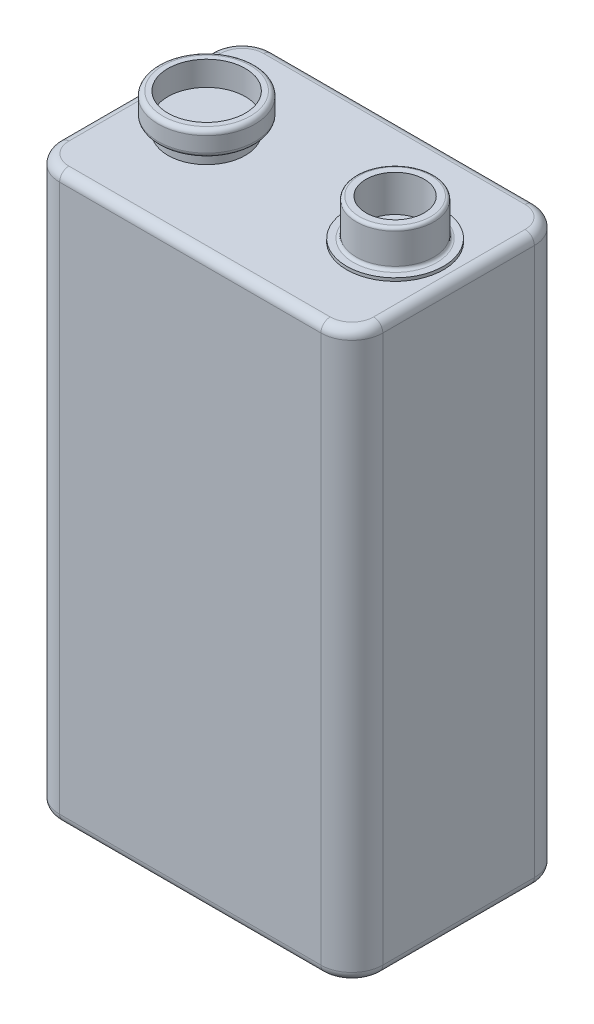
ISO-10303-21;
HEADER;
FILE_DESCRIPTION(('STEP AP214'),'2;1');
FILE_NAME('part.step','',(''),(''),'','','');
FILE_SCHEMA(('AUTOMOTIVE_DESIGN { 1 0 10303 214 1 1 1 1 }'));
ENDSEC;
DATA;
#1=APPLICATION_CONTEXT('core data for automotive mechanical design processes');
#2=APPLICATION_PROTOCOL_DEFINITION('international standard','automotive_design',2000,#1);
#3=PRODUCT_CONTEXT('',#1,'mechanical');
#4=PRODUCT('Part','Part','',(#3));
#5=PRODUCT_RELATED_PRODUCT_CATEGORY('part','',(#4));
#6=PRODUCT_DEFINITION_FORMATION('','',#4);
#7=PRODUCT_DEFINITION_CONTEXT('part definition',#1,'design');
#8=PRODUCT_DEFINITION('design','',#6,#7);
#9=PRODUCT_DEFINITION_SHAPE('','',#8);
#10=(LENGTH_UNIT() NAMED_UNIT(*) SI_UNIT(.MILLI.,.METRE.));
#11=(NAMED_UNIT(*) PLANE_ANGLE_UNIT() SI_UNIT($,.RADIAN.));
#12=(NAMED_UNIT(*) SI_UNIT($,.STERADIAN.) SOLID_ANGLE_UNIT());
#13=UNCERTAINTY_MEASURE_WITH_UNIT(LENGTH_MEASURE(1.E-05),#10,'distance_accuracy_value','');
#14=(GEOMETRIC_REPRESENTATION_CONTEXT(3) GLOBAL_UNCERTAINTY_ASSIGNED_CONTEXT((#13)) GLOBAL_UNIT_ASSIGNED_CONTEXT((#10,
#11,#12)) REPRESENTATION_CONTEXT('',''));
#15=CARTESIAN_POINT('',(0.,0.,0.));
#16=DIRECTION('',(0.,0.,1.));
#17=DIRECTION('',(1.,0.,0.));
#18=AXIS2_PLACEMENT_3D('',#15,#16,#17);
#19=CARTESIAN_POINT('',(5.842,49.4,-8.75));
#20=DIRECTION('',(0.,1.,0.));
#21=DIRECTION('',(0.,0.,1.));
#22=AXIS2_PLACEMENT_3D('',#19,#20,#21);
#23=PLANE('',#22);
#24=CARTESIAN_POINT('',(5.842,49.4,-8.75));
#25=DIRECTION('',(0.,1.,0.));
#26=DIRECTION('',(0.,0.,1.));
#27=AXIS2_PLACEMENT_3D('',#24,#25,#26);
#28=CIRCLE('',#27,3.58775);
#29=CARTESIAN_POINT('',(5.842,49.4,-5.16225));
#30=VERTEX_POINT('',#29);
#31=EDGE_CURVE('E65',#30,#30,#28,.T.);
#32=ORIENTED_EDGE('',*,*,#31,.T.);
#33=EDGE_LOOP('',(#32));
#34=FACE_BOUND('',#33,.T.);
#35=CARTESIAN_POINT('',(5.842,49.4,-8.75));
#36=DIRECTION('',(0.,1.,0.));
#37=DIRECTION('',(0.,0.,1.));
#38=AXIS2_PLACEMENT_3D('',#35,#36,#37);
#39=CIRCLE('',#38,3.175);
#40=CARTESIAN_POINT('',(5.842,49.4,-5.575));
#41=VERTEX_POINT('',#40);
#42=EDGE_CURVE('E70',#41,#41,#39,.T.);
#43=ORIENTED_EDGE('',*,*,#42,.F.);
#44=EDGE_LOOP('',(#43));
#45=FACE_BOUND('',#44,.T.);
#46=ADVANCED_FACE('F50',(#34,#45),#23,.T.);
#47=CARTESIAN_POINT('',(5.842,47.4,-8.75));
#48=DIRECTION('',(0.,1.,0.));
#49=DIRECTION('',(0.,0.,1.));
#50=AXIS2_PLACEMENT_3D('',#47,#48,#49);
#51=PLANE('',#50);
#52=CARTESIAN_POINT('',(5.842,47.4,-8.75));
#53=DIRECTION('',(0.,1.,0.));
#54=DIRECTION('',(0.,0.,1.));
#55=AXIS2_PLACEMENT_3D('',#52,#53,#54);
#56=CIRCLE('',#55,3.58775);
#57=CARTESIAN_POINT('',(5.842,47.4,-5.16225));
#58=VERTEX_POINT('',#57);
#59=EDGE_CURVE('E11',#58,#58,#56,.F.);
#60=ORIENTED_EDGE('',*,*,#59,.T.);
#61=EDGE_LOOP('',(#60));
#62=FACE_BOUND('',#61,.T.);
#63=CARTESIAN_POINT('',(5.842,47.4,-8.75));
#64=DIRECTION('',(0.,1.,0.));
#65=DIRECTION('',(0.,0.,1.));
#66=AXIS2_PLACEMENT_3D('',#63,#64,#65);
#67=CIRCLE('',#66,3.175);
#68=CARTESIAN_POINT('',(5.842,47.4,-5.575));
#69=VERTEX_POINT('',#68);
#70=EDGE_CURVE('E71',#69,#69,#67,.T.);
#71=ORIENTED_EDGE('',*,*,#70,.T.);
#72=EDGE_LOOP('',(#71));
#73=FACE_BOUND('',#72,.T.);
#74=ADVANCED_FACE('F81',(#62,#73),#51,.F.);
#75=CARTESIAN_POINT('',(5.842,49.4,-8.75));
#76=DIRECTION('',(0.,-1.,0.));
#77=DIRECTION('',(0.,0.,-1.));
#78=AXIS2_PLACEMENT_3D('',#75,#76,#77);
#79=CYLINDRICAL_SURFACE('',#78,3.96875);
#80=CARTESIAN_POINT('',(5.842,49.019,-8.75));
#81=DIRECTION('',(0.,1.,0.));
#82=DIRECTION('',(0.,0.,1.));
#83=AXIS2_PLACEMENT_3D('',#80,#81,#82);
#84=CIRCLE('',#83,3.96875);
#85=CARTESIAN_POINT('',(5.842,49.019,-4.78125));
#86=VERTEX_POINT('',#85);
#87=EDGE_CURVE('E57',#86,#86,#84,.F.);
#88=ORIENTED_EDGE('',*,*,#87,.T.);
#89=EDGE_LOOP('',(#88));
#90=FACE_BOUND('',#89,.T.);
#91=CARTESIAN_POINT('',(5.842,47.781,-8.75));
#92=DIRECTION('',(0.,1.,0.));
#93=DIRECTION('',(0.,0.,1.));
#94=AXIS2_PLACEMENT_3D('',#91,#92,#93);
#95=CIRCLE('',#94,3.96875);
#96=CARTESIAN_POINT('',(5.842,47.781,-4.78125));
#97=VERTEX_POINT('',#96);
#98=EDGE_CURVE('E61',#97,#97,#95,.T.);
#99=ORIENTED_EDGE('',*,*,#98,.T.);
#100=EDGE_LOOP('',(#99));
#101=FACE_BOUND('',#100,.T.);
#102=ADVANCED_FACE('F87',(#90,#101),#79,.T.);
#103=CARTESIAN_POINT('',(5.842,49.4,-8.75));
#104=DIRECTION('',(0.,-1.,0.));
#105=DIRECTION('',(0.,0.,-1.));
#106=AXIS2_PLACEMENT_3D('',#103,#104,#105);
#107=CYLINDRICAL_SURFACE('',#106,3.175);
#108=ORIENTED_EDGE('',*,*,#42,.T.);
#109=EDGE_LOOP('',(#108));
#110=FACE_BOUND('',#109,.T.);
#111=ORIENTED_EDGE('',*,*,#70,.F.);
#112=EDGE_LOOP('',(#111));
#113=FACE_BOUND('',#112,.T.);
#114=ADVANCED_FACE('F77',(#110,#113),#107,.F.);
#115=CARTESIAN_POINT('',(5.842,49.019,-8.75));
#116=DIRECTION('',(0.,1.,0.));
#117=DIRECTION('',(0.,0.,1.));
#118=AXIS2_PLACEMENT_3D('',#115,#116,#117);
#119=TOROIDAL_SURFACE('',#118,3.58775,0.381);
#120=ORIENTED_EDGE('',*,*,#87,.F.);
#121=EDGE_LOOP('',(#120));
#122=FACE_BOUND('',#121,.T.);
#123=ORIENTED_EDGE('',*,*,#31,.F.);
#124=EDGE_LOOP('',(#123));
#125=FACE_BOUND('',#124,.T.);
#126=ADVANCED_FACE('F92',(#122,#125),#119,.T.);
#127=CARTESIAN_POINT('',(5.842,47.781,-8.75));
#128=DIRECTION('',(0.,1.,0.));
#129=DIRECTION('',(0.,0.,1.));
#130=AXIS2_PLACEMENT_3D('',#127,#128,#129);
#131=TOROIDAL_SURFACE('',#130,3.58775,0.381);
#132=ORIENTED_EDGE('',*,*,#59,.F.);
#133=EDGE_LOOP('',(#132));
#134=FACE_BOUND('',#133,.T.);
#135=ORIENTED_EDGE('',*,*,#98,.F.);
#136=EDGE_LOOP('',(#135));
#137=FACE_BOUND('',#136,.T.);
#138=ADVANCED_FACE('F52',(#134,#137),#131,.T.);
#139=CLOSED_SHELL('',(#46,#74,#102,#114,#126,#138));
#140=MANIFOLD_SOLID_BREP('B2',#139);
#141=CARTESIAN_POINT('',(0.,0.,-17.5));
#142=DIRECTION('',(-1.,0.,0.));
#143=DIRECTION('',(0.,0.,1.));
#144=AXIS2_PLACEMENT_3D('',#141,#142,#143);
#145=PLANE('',#144);
#146=DIRECTION('',(0.,-1.,0.));
#147=VECTOR('',#146,1.);
#148=CARTESIAN_POINT('',(0.,46.4,-2.54));
#149=LINE('',#148,#147);
#150=CARTESIAN_POINT('',(0.,0.761999999999999,-2.54));
#151=VERTEX_POINT('',#150);
#152=CARTESIAN_POINT('',(0.,45.638,-2.54));
#153=VERTEX_POINT('',#152);
#154=EDGE_CURVE('E361',#151,#153,#149,.F.);
#155=ORIENTED_EDGE('',*,*,#154,.T.);
#156=DIRECTION('',(0.,0.,1.));
#157=VECTOR('',#156,1.);
#158=CARTESIAN_POINT('',(0.,45.638,-17.5));
#159=LINE('',#158,#157);
#160=CARTESIAN_POINT('',(0.,45.638,-14.96));
#161=VERTEX_POINT('',#160);
#162=EDGE_CURVE('E320',#153,#161,#159,.F.);
#163=ORIENTED_EDGE('',*,*,#162,.T.);
#164=DIRECTION('',(0.,-1.,0.));
#165=VECTOR('',#164,1.);
#166=CARTESIAN_POINT('',(0.,0.,-14.96));
#167=LINE('',#166,#165);
#168=CARTESIAN_POINT('',(0.,0.762,-14.96));
#169=VERTEX_POINT('',#168);
#170=EDGE_CURVE('E426',#161,#169,#167,.T.);
#171=ORIENTED_EDGE('',*,*,#170,.T.);
#172=DIRECTION('',(0.,0.,1.));
#173=VECTOR('',#172,1.);
#174=CARTESIAN_POINT('',(0.,0.762,-17.5));
#175=LINE('',#174,#173);
#176=EDGE_CURVE('E318',#169,#151,#175,.T.);
#177=ORIENTED_EDGE('',*,*,#176,.T.);
#178=EDGE_LOOP('',(#155,#163,#171,#177));
#179=FACE_BOUND('',#178,.T.);
#180=ADVANCED_FACE('F141',(#179),#145,.T.);
#181=CARTESIAN_POINT('',(0.,46.4,-17.5));
#182=DIRECTION('',(0.,1.,0.));
#183=DIRECTION('',(0.,0.,1.));
#184=AXIS2_PLACEMENT_3D('',#181,#182,#183);
#185=PLANE('',#184);
#186=CARTESIAN_POINT('',(5.842,46.4,-8.75));
#187=DIRECTION('',(0.,1.,0.));
#188=DIRECTION('',(0.,0.,1.));
#189=AXIS2_PLACEMENT_3D('',#186,#187,#188);
#190=CIRCLE('',#189,3.175);
#191=CARTESIAN_POINT('',(5.842,46.4,-5.575));
#192=VERTEX_POINT('',#191);
#193=EDGE_CURVE('E418',#192,#192,#190,.T.);
#194=ORIENTED_EDGE('',*,*,#193,.F.);
#195=EDGE_LOOP('',(#194));
#196=FACE_BOUND('',#195,.T.);
#197=CARTESIAN_POINT('',(21.293,46.4,-8.75));
#198=DIRECTION('',(0.,1.,0.));
#199=DIRECTION('',(0.,0.,1.));
#200=AXIS2_PLACEMENT_3D('',#197,#198,#199);
#201=CIRCLE('',#200,3.96875);
#202=CARTESIAN_POINT('',(21.293,46.4,-4.78125));
#203=VERTEX_POINT('',#202);
#204=EDGE_CURVE('E412',#203,#203,#201,.T.);
#205=ORIENTED_EDGE('',*,*,#204,.F.);
#206=EDGE_LOOP('',(#205));
#207=FACE_BOUND('',#206,.T.);
#208=DIRECTION('',(-1.,0.,0.));
#209=VECTOR('',#208,1.);
#210=CARTESIAN_POINT('',(23.96,46.4,-0.762));
#211=LINE('',#210,#209);
#212=CARTESIAN_POINT('',(2.54,46.4,-0.762));
#213=VERTEX_POINT('',#212);
#214=CARTESIAN_POINT('',(23.96,46.4,-0.762));
#215=VERTEX_POINT('',#214);
#216=EDGE_CURVE('E258',#213,#215,#211,.F.);
#217=ORIENTED_EDGE('',*,*,#216,.T.);
#218=CARTESIAN_POINT('',(23.96,46.4,-2.54));
#219=DIRECTION('',(0.,1.,0.));
#220=DIRECTION('',(0.,0.,1.));
#221=AXIS2_PLACEMENT_3D('',#218,#219,#220);
#222=CIRCLE('',#221,1.778);
#223=CARTESIAN_POINT('',(25.738,46.4,-2.54));
#224=VERTEX_POINT('',#223);
#225=EDGE_CURVE('E295',#215,#224,#222,.T.);
#226=ORIENTED_EDGE('',*,*,#225,.T.);
#227=DIRECTION('',(0.,0.,1.));
#228=VECTOR('',#227,1.);
#229=CARTESIAN_POINT('',(25.738,46.4,-17.5));
#230=LINE('',#229,#228);
#231=CARTESIAN_POINT('',(25.738,46.4,-14.96));
#232=VERTEX_POINT('',#231);
#233=EDGE_CURVE('E293',#224,#232,#230,.F.);
#234=ORIENTED_EDGE('',*,*,#233,.T.);
#235=CARTESIAN_POINT('',(23.96,46.4,-14.96));
#236=DIRECTION('',(0.,1.,0.));
#237=DIRECTION('',(0.,0.,1.));
#238=AXIS2_PLACEMENT_3D('',#235,#236,#237);
#239=CIRCLE('',#238,1.778);
#240=CARTESIAN_POINT('',(23.96,46.4,-16.738));
#241=VERTEX_POINT('',#240);
#242=EDGE_CURVE('E291',#232,#241,#239,.T.);
#243=ORIENTED_EDGE('',*,*,#242,.T.);
#244=DIRECTION('',(-1.,0.,0.));
#245=VECTOR('',#244,1.);
#246=CARTESIAN_POINT('',(0.,46.4,-16.738));
#247=LINE('',#246,#245);
#248=CARTESIAN_POINT('',(2.54,46.4,-16.738));
#249=VERTEX_POINT('',#248);
#250=EDGE_CURVE('E289',#241,#249,#247,.T.);
#251=ORIENTED_EDGE('',*,*,#250,.T.);
#252=CARTESIAN_POINT('',(2.54,46.4,-14.96));
#253=DIRECTION('',(0.,1.,0.));
#254=DIRECTION('',(0.,0.,1.));
#255=AXIS2_PLACEMENT_3D('',#252,#253,#254);
#256=CIRCLE('',#255,1.778);
#257=CARTESIAN_POINT('',(0.762,46.4,-14.96));
#258=VERTEX_POINT('',#257);
#259=EDGE_CURVE('E287',#249,#258,#256,.T.);
#260=ORIENTED_EDGE('',*,*,#259,.T.);
#261=DIRECTION('',(0.,0.,1.));
#262=VECTOR('',#261,1.);
#263=CARTESIAN_POINT('',(0.762,46.4,-17.5));
#264=LINE('',#263,#262);
#265=CARTESIAN_POINT('',(0.762,46.4,-2.54));
#266=VERTEX_POINT('',#265);
#267=EDGE_CURVE('E261',#258,#266,#264,.T.);
#268=ORIENTED_EDGE('',*,*,#267,.T.);
#269=CARTESIAN_POINT('',(2.54,46.4,-2.54));
#270=DIRECTION('',(0.,1.,0.));
#271=DIRECTION('',(0.,0.,1.));
#272=AXIS2_PLACEMENT_3D('',#269,#270,#271);
#273=CIRCLE('',#272,1.778);
#274=EDGE_CURVE('E253',#266,#213,#273,.T.);
#275=ORIENTED_EDGE('',*,*,#274,.T.);
#276=EDGE_LOOP('',(#217,#226,#234,#243,#251,#260,#268,#275));
#277=FACE_BOUND('',#276,.T.);
#278=ADVANCED_FACE('F255',(#196,#207,#277),#185,.T.);
#279=CARTESIAN_POINT('',(26.5,0.,-17.5));
#280=DIRECTION('',(1.,0.,0.));
#281=DIRECTION('',(0.,0.,-1.));
#282=AXIS2_PLACEMENT_3D('',#279,#280,#281);
#283=PLANE('',#282);
#284=DIRECTION('',(0.,1.,0.));
#285=VECTOR('',#284,1.);
#286=CARTESIAN_POINT('',(26.5,0.,-14.96));
#287=LINE('',#286,#285);
#288=CARTESIAN_POINT('',(26.5,0.762,-14.96));
#289=VERTEX_POINT('',#288);
#290=CARTESIAN_POINT('',(26.5,45.638,-14.96));
#291=VERTEX_POINT('',#290);
#292=EDGE_CURVE('E279',#289,#291,#287,.T.);
#293=ORIENTED_EDGE('',*,*,#292,.T.);
#294=DIRECTION('',(0.,0.,1.));
#295=VECTOR('',#294,1.);
#296=CARTESIAN_POINT('',(26.5,45.638,-17.5));
#297=LINE('',#296,#295);
#298=CARTESIAN_POINT('',(26.5,45.638,-2.54));
#299=VERTEX_POINT('',#298);
#300=EDGE_CURVE('E304',#291,#299,#297,.T.);
#301=ORIENTED_EDGE('',*,*,#300,.T.);
#302=DIRECTION('',(0.,1.,0.));
#303=VECTOR('',#302,1.);
#304=CARTESIAN_POINT('',(26.5,0.,-2.54));
#305=LINE('',#304,#303);
#306=CARTESIAN_POINT('',(26.5,0.762,-2.54));
#307=VERTEX_POINT('',#306);
#308=EDGE_CURVE('E282',#299,#307,#305,.F.);
#309=ORIENTED_EDGE('',*,*,#308,.T.);
#310=DIRECTION('',(0.,0.,1.));
#311=VECTOR('',#310,1.);
#312=CARTESIAN_POINT('',(26.5,0.762,-17.5));
#313=LINE('',#312,#311);
#314=EDGE_CURVE('E302',#307,#289,#313,.F.);
#315=ORIENTED_EDGE('',*,*,#314,.T.);
#316=EDGE_LOOP('',(#293,#301,#309,#315));
#317=FACE_BOUND('',#316,.T.);
#318=ADVANCED_FACE('F444',(#317),#283,.T.);
#319=CARTESIAN_POINT('',(0.,0.,-17.5));
#320=DIRECTION('',(0.,-1.,0.));
#321=DIRECTION('',(0.,0.,-1.));
#322=AXIS2_PLACEMENT_3D('',#319,#320,#321);
#323=PLANE('',#322);
#324=DIRECTION('',(1.,0.,0.));
#325=VECTOR('',#324,1.);
#326=CARTESIAN_POINT('',(2.54,0.,-0.762));
#327=LINE('',#326,#325);
#328=CARTESIAN_POINT('',(23.96,0.,-0.762));
#329=VERTEX_POINT('',#328);
#330=CARTESIAN_POINT('',(2.54,0.,-0.762));
#331=VERTEX_POINT('',#330);
#332=EDGE_CURVE('E156',#329,#331,#327,.F.);
#333=ORIENTED_EDGE('',*,*,#332,.T.);
#334=CARTESIAN_POINT('',(2.54,0.,-2.54));
#335=DIRECTION('',(0.,-1.,0.));
#336=DIRECTION('',(0.,0.,-1.));
#337=AXIS2_PLACEMENT_3D('',#334,#335,#336);
#338=CIRCLE('',#337,1.778);
#339=CARTESIAN_POINT('',(0.762,0.,-2.54));
#340=VERTEX_POINT('',#339);
#341=EDGE_CURVE('E338',#331,#340,#338,.T.);
#342=ORIENTED_EDGE('',*,*,#341,.T.);
#343=DIRECTION('',(0.,0.,1.));
#344=VECTOR('',#343,1.);
#345=CARTESIAN_POINT('',(0.762,0.,-17.5));
#346=LINE('',#345,#344);
#347=CARTESIAN_POINT('',(0.762,0.,-14.96));
#348=VERTEX_POINT('',#347);
#349=EDGE_CURVE('E326',#340,#348,#346,.F.);
#350=ORIENTED_EDGE('',*,*,#349,.T.);
#351=CARTESIAN_POINT('',(2.54,0.,-14.96));
#352=DIRECTION('',(0.,-1.,0.));
#353=DIRECTION('',(0.,0.,-1.));
#354=AXIS2_PLACEMENT_3D('',#351,#352,#353);
#355=CIRCLE('',#354,1.778);
#356=CARTESIAN_POINT('',(2.54,0.,-16.738));
#357=VERTEX_POINT('',#356);
#358=EDGE_CURVE('E328',#348,#357,#355,.T.);
#359=ORIENTED_EDGE('',*,*,#358,.T.);
#360=DIRECTION('',(1.,0.,0.));
#361=VECTOR('',#360,1.);
#362=CARTESIAN_POINT('',(0.,0.,-16.738));
#363=LINE('',#362,#361);
#364=CARTESIAN_POINT('',(23.96,0.,-16.738));
#365=VERTEX_POINT('',#364);
#366=EDGE_CURVE('E330',#357,#365,#363,.T.);
#367=ORIENTED_EDGE('',*,*,#366,.T.);
#368=CARTESIAN_POINT('',(23.96,0.,-14.96));
#369=DIRECTION('',(0.,-1.,0.));
#370=DIRECTION('',(0.,0.,-1.));
#371=AXIS2_PLACEMENT_3D('',#368,#369,#370);
#372=CIRCLE('',#371,1.778);
#373=CARTESIAN_POINT('',(25.738,0.,-14.96));
#374=VERTEX_POINT('',#373);
#375=EDGE_CURVE('E332',#365,#374,#372,.T.);
#376=ORIENTED_EDGE('',*,*,#375,.T.);
#377=DIRECTION('',(0.,0.,1.));
#378=VECTOR('',#377,1.);
#379=CARTESIAN_POINT('',(25.738,0.,-17.5));
#380=LINE('',#379,#378);
#381=CARTESIAN_POINT('',(25.738,0.,-2.54));
#382=VERTEX_POINT('',#381);
#383=EDGE_CURVE('E334',#374,#382,#380,.T.);
#384=ORIENTED_EDGE('',*,*,#383,.T.);
#385=CARTESIAN_POINT('',(23.96,0.,-2.54));
#386=DIRECTION('',(0.,-1.,0.));
#387=DIRECTION('',(0.,0.,-1.));
#388=AXIS2_PLACEMENT_3D('',#385,#386,#387);
#389=CIRCLE('',#388,1.778);
#390=EDGE_CURVE('E161',#382,#329,#389,.T.);
#391=ORIENTED_EDGE('',*,*,#390,.T.);
#392=EDGE_LOOP('',(#333,#342,#350,#359,#367,#376,#384,#391));
#393=FACE_BOUND('',#392,.T.);
#394=ADVANCED_FACE('F466',(#393),#323,.T.);
#395=CARTESIAN_POINT('',(0.,0.,-17.5));
#396=DIRECTION('',(0.,0.,-1.));
#397=DIRECTION('',(-1.,0.,0.));
#398=AXIS2_PLACEMENT_3D('',#395,#396,#397);
#399=PLANE('',#398);
#400=DIRECTION('',(0.,-1.,0.));
#401=VECTOR('',#400,1.);
#402=CARTESIAN_POINT('',(2.54,0.,-17.5));
#403=LINE('',#402,#401);
#404=CARTESIAN_POINT('',(2.54,0.762,-17.5));
#405=VERTEX_POINT('',#404);
#406=CARTESIAN_POINT('',(2.54,45.638,-17.5));
#407=VERTEX_POINT('',#406);
#408=EDGE_CURVE('E432',#405,#407,#403,.F.);
#409=ORIENTED_EDGE('',*,*,#408,.T.);
#410=DIRECTION('',(-1.,0.,0.));
#411=VECTOR('',#410,1.);
#412=CARTESIAN_POINT('',(0.,45.638,-17.5));
#413=LINE('',#412,#411);
#414=CARTESIAN_POINT('',(23.96,45.638,-17.5));
#415=VERTEX_POINT('',#414);
#416=EDGE_CURVE('E312',#407,#415,#413,.F.);
#417=ORIENTED_EDGE('',*,*,#416,.T.);
#418=DIRECTION('',(0.,1.,0.));
#419=VECTOR('',#418,1.);
#420=CARTESIAN_POINT('',(23.96,0.,-17.5));
#421=LINE('',#420,#419);
#422=CARTESIAN_POINT('',(23.96,0.762,-17.5));
#423=VERTEX_POINT('',#422);
#424=EDGE_CURVE('E429',#415,#423,#421,.F.);
#425=ORIENTED_EDGE('',*,*,#424,.T.);
#426=DIRECTION('',(1.,0.,0.));
#427=VECTOR('',#426,1.);
#428=CARTESIAN_POINT('',(0.,0.762,-17.5));
#429=LINE('',#428,#427);
#430=EDGE_CURVE('E310',#423,#405,#429,.F.);
#431=ORIENTED_EDGE('',*,*,#430,.T.);
#432=EDGE_LOOP('',(#409,#417,#425,#431));
#433=FACE_BOUND('',#432,.T.);
#434=ADVANCED_FACE('F527',(#433),#399,.T.);
#435=CARTESIAN_POINT('',(0.,0.,0.));
#436=DIRECTION('',(0.,0.,-1.));
#437=DIRECTION('',(-1.,0.,0.));
#438=AXIS2_PLACEMENT_3D('',#435,#436,#437);
#439=PLANE('',#438);
#440=DIRECTION('',(0.,-1.,0.));
#441=VECTOR('',#440,1.);
#442=CARTESIAN_POINT('',(2.54,0.,0.));
#443=LINE('',#442,#441);
#444=CARTESIAN_POINT('',(2.54,45.638,0.));
#445=VERTEX_POINT('',#444);
#446=CARTESIAN_POINT('',(2.54,0.762,0.));
#447=VERTEX_POINT('',#446);
#448=EDGE_CURVE('E438',#445,#447,#443,.T.);
#449=ORIENTED_EDGE('',*,*,#448,.T.);
#450=DIRECTION('',(1.,0.,0.));
#451=VECTOR('',#450,1.);
#452=CARTESIAN_POINT('',(23.96,0.762,0.));
#453=LINE('',#452,#451);
#454=CARTESIAN_POINT('',(23.96,0.761999999999999,0.));
#455=VERTEX_POINT('',#454);
#456=EDGE_CURVE('E342',#447,#455,#453,.T.);
#457=ORIENTED_EDGE('',*,*,#456,.T.);
#458=DIRECTION('',(0.,1.,0.));
#459=VECTOR('',#458,1.);
#460=CARTESIAN_POINT('',(23.96,46.4,0.));
#461=LINE('',#460,#459);
#462=CARTESIAN_POINT('',(23.96,45.638,0.));
#463=VERTEX_POINT('',#462);
#464=EDGE_CURVE('E435',#455,#463,#461,.T.);
#465=ORIENTED_EDGE('',*,*,#464,.T.);
#466=DIRECTION('',(-1.,0.,0.));
#467=VECTOR('',#466,1.);
#468=CARTESIAN_POINT('',(2.54,45.638,0.));
#469=LINE('',#468,#467);
#470=EDGE_CURVE('E340',#463,#445,#469,.T.);
#471=ORIENTED_EDGE('',*,*,#470,.T.);
#472=EDGE_LOOP('',(#449,#457,#465,#471));
#473=FACE_BOUND('',#472,.T.);
#474=ADVANCED_FACE('F485',(#473),#439,.F.);
#475=CARTESIAN_POINT('',(2.54,0.,-14.96));
#476=DIRECTION('',(0.,-1.,0.));
#477=DIRECTION('',(0.,0.,-1.));
#478=AXIS2_PLACEMENT_3D('',#475,#476,#477);
#479=CYLINDRICAL_SURFACE('',#478,2.54);
#480=ORIENTED_EDGE('',*,*,#170,.F.);
#481=CARTESIAN_POINT('',(2.54,45.638,-14.96));
#482=DIRECTION('',(0.,1.,0.));
#483=DIRECTION('',(0.,0.,1.));
#484=AXIS2_PLACEMENT_3D('',#481,#482,#483);
#485=CIRCLE('',#484,2.54);
#486=EDGE_CURVE('E316',#161,#407,#485,.F.);
#487=ORIENTED_EDGE('',*,*,#486,.T.);
#488=ORIENTED_EDGE('',*,*,#408,.F.);
#489=CARTESIAN_POINT('',(2.54,0.762,-14.96));
#490=DIRECTION('',(0.,-1.,0.));
#491=DIRECTION('',(0.,0.,-1.));
#492=AXIS2_PLACEMENT_3D('',#489,#490,#491);
#493=CIRCLE('',#492,2.54);
#494=EDGE_CURVE('E314',#405,#169,#493,.F.);
#495=ORIENTED_EDGE('',*,*,#494,.T.);
#496=EDGE_LOOP('',(#480,#487,#488,#495));
#497=FACE_BOUND('',#496,.T.);
#498=ADVANCED_FACE('F513',(#497),#479,.T.);
#499=CARTESIAN_POINT('',(2.54,0.,-2.54));
#500=DIRECTION('',(0.,1.,0.));
#501=DIRECTION('',(0.,0.,1.));
#502=AXIS2_PLACEMENT_3D('',#499,#500,#501);
#503=CYLINDRICAL_SURFACE('',#502,2.54);
#504=ORIENTED_EDGE('',*,*,#448,.F.);
#505=CARTESIAN_POINT('',(2.54,45.638,-2.54));
#506=DIRECTION('',(0.,1.,0.));
#507=DIRECTION('',(0.,0.,1.));
#508=AXIS2_PLACEMENT_3D('',#505,#506,#507);
#509=CIRCLE('',#508,2.54);
#510=EDGE_CURVE('E270',#445,#153,#509,.F.);
#511=ORIENTED_EDGE('',*,*,#510,.T.);
#512=ORIENTED_EDGE('',*,*,#154,.F.);
#513=CARTESIAN_POINT('',(2.54,0.762,-2.54));
#514=DIRECTION('',(0.,-1.,0.));
#515=DIRECTION('',(0.,0.,-1.));
#516=AXIS2_PLACEMENT_3D('',#513,#514,#515);
#517=CIRCLE('',#516,2.54);
#518=EDGE_CURVE('E322',#151,#447,#517,.F.);
#519=ORIENTED_EDGE('',*,*,#518,.T.);
#520=EDGE_LOOP('',(#504,#511,#512,#519));
#521=FACE_BOUND('',#520,.T.);
#522=ADVANCED_FACE('F483',(#521),#503,.T.);
#523=CARTESIAN_POINT('',(23.96,0.,-14.96));
#524=DIRECTION('',(0.,1.,0.));
#525=DIRECTION('',(0.,0.,1.));
#526=AXIS2_PLACEMENT_3D('',#523,#524,#525);
#527=CYLINDRICAL_SURFACE('',#526,2.54);
#528=ORIENTED_EDGE('',*,*,#424,.F.);
#529=CARTESIAN_POINT('',(23.96,45.638,-14.96));
#530=DIRECTION('',(0.,1.,0.));
#531=DIRECTION('',(0.,0.,1.));
#532=AXIS2_PLACEMENT_3D('',#529,#530,#531);
#533=CIRCLE('',#532,2.54);
#534=EDGE_CURVE('E308',#415,#291,#533,.F.);
#535=ORIENTED_EDGE('',*,*,#534,.T.);
#536=ORIENTED_EDGE('',*,*,#292,.F.);
#537=CARTESIAN_POINT('',(23.96,0.762,-14.96));
#538=DIRECTION('',(0.,-1.,0.));
#539=DIRECTION('',(0.,0.,-1.));
#540=AXIS2_PLACEMENT_3D('',#537,#538,#539);
#541=CIRCLE('',#540,2.54);
#542=EDGE_CURVE('E306',#289,#423,#541,.F.);
#543=ORIENTED_EDGE('',*,*,#542,.T.);
#544=EDGE_LOOP('',(#528,#535,#536,#543));
#545=FACE_BOUND('',#544,.T.);
#546=ADVANCED_FACE('F526',(#545),#527,.T.);
#547=CARTESIAN_POINT('',(23.96,0.,-2.54));
#548=DIRECTION('',(0.,-1.,0.));
#549=DIRECTION('',(0.,0.,-1.));
#550=AXIS2_PLACEMENT_3D('',#547,#548,#549);
#551=CYLINDRICAL_SURFACE('',#550,2.54);
#552=ORIENTED_EDGE('',*,*,#308,.F.);
#553=CARTESIAN_POINT('',(23.96,45.638,-2.54));
#554=DIRECTION('',(0.,1.,0.));
#555=DIRECTION('',(0.,0.,1.));
#556=AXIS2_PLACEMENT_3D('',#553,#554,#555);
#557=CIRCLE('',#556,2.54);
#558=EDGE_CURVE('E299',#299,#463,#557,.F.);
#559=ORIENTED_EDGE('',*,*,#558,.T.);
#560=ORIENTED_EDGE('',*,*,#464,.F.);
#561=CARTESIAN_POINT('',(23.96,0.762,-2.54));
#562=DIRECTION('',(0.,-1.,0.));
#563=DIRECTION('',(0.,0.,-1.));
#564=AXIS2_PLACEMENT_3D('',#561,#562,#563);
#565=CIRCLE('',#564,2.54);
#566=EDGE_CURVE('E297',#455,#307,#565,.F.);
#567=ORIENTED_EDGE('',*,*,#566,.T.);
#568=EDGE_LOOP('',(#552,#559,#560,#567));
#569=FACE_BOUND('',#568,.T.);
#570=ADVANCED_FACE('F487',(#569),#551,.T.);
#571=CARTESIAN_POINT('',(2.54,45.638,-14.96));
#572=DIRECTION('',(0.,1.,0.));
#573=DIRECTION('',(0.,0.,1.));
#574=AXIS2_PLACEMENT_3D('',#571,#572,#573);
#575=TOROIDAL_SURFACE('',#574,1.778,0.762);
#576=CARTESIAN_POINT('',(2.54,45.638,-16.738));
#577=DIRECTION('',(1.,0.,0.));
#578=DIRECTION('',(0.,0.,-1.));
#579=AXIS2_PLACEMENT_3D('',#576,#577,#578);
#580=CIRCLE('',#579,0.762);
#581=EDGE_CURVE('E355',#407,#249,#580,.T.);
#582=ORIENTED_EDGE('',*,*,#581,.F.);
#583=ORIENTED_EDGE('',*,*,#486,.F.);
#584=CARTESIAN_POINT('',(0.762,45.638,-14.96));
#585=DIRECTION('',(0.,0.,1.));
#586=DIRECTION('',(1.,0.,0.));
#587=AXIS2_PLACEMENT_3D('',#584,#585,#586);
#588=CIRCLE('',#587,0.762);
#589=EDGE_CURVE('E358',#258,#161,#588,.T.);
#590=ORIENTED_EDGE('',*,*,#589,.F.);
#591=ORIENTED_EDGE('',*,*,#259,.F.);
#592=EDGE_LOOP('',(#582,#583,#590,#591));
#593=FACE_BOUND('',#592,.T.);
#594=ADVANCED_FACE('F508',(#593),#575,.T.);
#595=CARTESIAN_POINT('',(0.762,45.638,-17.5));
#596=DIRECTION('',(0.,0.,1.));
#597=DIRECTION('',(1.,0.,0.));
#598=AXIS2_PLACEMENT_3D('',#595,#596,#597);
#599=CYLINDRICAL_SURFACE('',#598,0.762);
#600=ORIENTED_EDGE('',*,*,#589,.T.);
#601=ORIENTED_EDGE('',*,*,#162,.F.);
#602=CARTESIAN_POINT('',(0.762,45.638,-2.54));
#603=DIRECTION('',(0.,0.,1.));
#604=DIRECTION('',(1.,0.,0.));
#605=AXIS2_PLACEMENT_3D('',#602,#603,#604);
#606=CIRCLE('',#605,0.762);
#607=EDGE_CURVE('E353',#266,#153,#606,.T.);
#608=ORIENTED_EDGE('',*,*,#607,.F.);
#609=ORIENTED_EDGE('',*,*,#267,.F.);
#610=EDGE_LOOP('',(#600,#601,#608,#609));
#611=FACE_BOUND('',#610,.T.);
#612=ADVANCED_FACE('F511',(#611),#599,.T.);
#613=CARTESIAN_POINT('',(0.,45.638,-16.738));
#614=DIRECTION('',(-1.,0.,0.));
#615=DIRECTION('',(0.,0.,1.));
#616=AXIS2_PLACEMENT_3D('',#613,#614,#615);
#617=CYLINDRICAL_SURFACE('',#616,0.762);
#618=ORIENTED_EDGE('',*,*,#581,.T.);
#619=ORIENTED_EDGE('',*,*,#250,.F.);
#620=CARTESIAN_POINT('',(23.96,45.638,-16.738));
#621=DIRECTION('',(1.,0.,0.));
#622=DIRECTION('',(0.,0.,-1.));
#623=AXIS2_PLACEMENT_3D('',#620,#621,#622);
#624=CIRCLE('',#623,0.762);
#625=EDGE_CURVE('E273',#415,#241,#624,.T.);
#626=ORIENTED_EDGE('',*,*,#625,.F.);
#627=ORIENTED_EDGE('',*,*,#416,.F.);
#628=EDGE_LOOP('',(#618,#619,#626,#627));
#629=FACE_BOUND('',#628,.T.);
#630=ADVANCED_FACE('F503',(#629),#617,.T.);
#631=CARTESIAN_POINT('',(2.54,45.638,-2.54));
#632=DIRECTION('',(0.,1.,0.));
#633=DIRECTION('',(0.,0.,1.));
#634=AXIS2_PLACEMENT_3D('',#631,#632,#633);
#635=TOROIDAL_SURFACE('',#634,1.778,0.762);
#636=ORIENTED_EDGE('',*,*,#607,.T.);
#637=ORIENTED_EDGE('',*,*,#510,.F.);
#638=CARTESIAN_POINT('',(2.54,45.638,-0.762));
#639=DIRECTION('',(1.,0.,0.));
#640=DIRECTION('',(0.,0.,-1.));
#641=AXIS2_PLACEMENT_3D('',#638,#639,#640);
#642=CIRCLE('',#641,0.762);
#643=EDGE_CURVE('E268',#213,#445,#642,.T.);
#644=ORIENTED_EDGE('',*,*,#643,.F.);
#645=ORIENTED_EDGE('',*,*,#274,.F.);
#646=EDGE_LOOP('',(#636,#637,#644,#645));
#647=FACE_BOUND('',#646,.T.);
#648=ADVANCED_FACE('F269',(#647),#635,.T.);
#649=CARTESIAN_POINT('',(23.96,45.638,-14.96));
#650=DIRECTION('',(0.,1.,0.));
#651=DIRECTION('',(0.,0.,1.));
#652=AXIS2_PLACEMENT_3D('',#649,#650,#651);
#653=TOROIDAL_SURFACE('',#652,1.778,0.762);
#654=ORIENTED_EDGE('',*,*,#625,.T.);
#655=ORIENTED_EDGE('',*,*,#242,.F.);
#656=CARTESIAN_POINT('',(25.738,45.638,-14.96));
#657=DIRECTION('',(0.,0.,1.));
#658=DIRECTION('',(1.,0.,0.));
#659=AXIS2_PLACEMENT_3D('',#656,#657,#658);
#660=CIRCLE('',#659,0.762);
#661=EDGE_CURVE('E274',#291,#232,#660,.T.);
#662=ORIENTED_EDGE('',*,*,#661,.F.);
#663=ORIENTED_EDGE('',*,*,#534,.F.);
#664=EDGE_LOOP('',(#654,#655,#662,#663));
#665=FACE_BOUND('',#664,.T.);
#666=ADVANCED_FACE('F498',(#665),#653,.T.);
#667=CARTESIAN_POINT('',(0.,45.638,-0.762));
#668=DIRECTION('',(1.,0.,0.));
#669=DIRECTION('',(0.,0.,-1.));
#670=AXIS2_PLACEMENT_3D('',#667,#668,#669);
#671=CYLINDRICAL_SURFACE('',#670,0.762);
#672=ORIENTED_EDGE('',*,*,#643,.T.);
#673=ORIENTED_EDGE('',*,*,#470,.F.);
#674=CARTESIAN_POINT('',(23.96,45.638,-0.762));
#675=DIRECTION('',(1.,0.,0.));
#676=DIRECTION('',(0.,0.,-1.));
#677=AXIS2_PLACEMENT_3D('',#674,#675,#676);
#678=CIRCLE('',#677,0.762);
#679=EDGE_CURVE('E277',#215,#463,#678,.T.);
#680=ORIENTED_EDGE('',*,*,#679,.F.);
#681=ORIENTED_EDGE('',*,*,#216,.F.);
#682=EDGE_LOOP('',(#672,#673,#680,#681));
#683=FACE_BOUND('',#682,.T.);
#684=ADVANCED_FACE('F276',(#683),#671,.T.);
#685=CARTESIAN_POINT('',(25.738,45.638,-17.5));
#686=DIRECTION('',(0.,0.,1.));
#687=DIRECTION('',(1.,0.,0.));
#688=AXIS2_PLACEMENT_3D('',#685,#686,#687);
#689=CYLINDRICAL_SURFACE('',#688,0.762);
#690=ORIENTED_EDGE('',*,*,#661,.T.);
#691=ORIENTED_EDGE('',*,*,#233,.F.);
#692=CARTESIAN_POINT('',(25.738,45.638,-2.54));
#693=DIRECTION('',(0.,0.,1.));
#694=DIRECTION('',(1.,0.,0.));
#695=AXIS2_PLACEMENT_3D('',#692,#693,#694);
#696=CIRCLE('',#695,0.762);
#697=EDGE_CURVE('E345',#299,#224,#696,.T.);
#698=ORIENTED_EDGE('',*,*,#697,.F.);
#699=ORIENTED_EDGE('',*,*,#300,.F.);
#700=EDGE_LOOP('',(#690,#691,#698,#699));
#701=FACE_BOUND('',#700,.T.);
#702=ADVANCED_FACE('F493',(#701),#689,.T.);
#703=CARTESIAN_POINT('',(23.96,45.638,-2.54));
#704=DIRECTION('',(0.,1.,0.));
#705=DIRECTION('',(0.,0.,1.));
#706=AXIS2_PLACEMENT_3D('',#703,#704,#705);
#707=TOROIDAL_SURFACE('',#706,1.778,0.762);
#708=ORIENTED_EDGE('',*,*,#679,.T.);
#709=ORIENTED_EDGE('',*,*,#558,.F.);
#710=ORIENTED_EDGE('',*,*,#697,.T.);
#711=ORIENTED_EDGE('',*,*,#225,.F.);
#712=EDGE_LOOP('',(#708,#709,#710,#711));
#713=FACE_BOUND('',#712,.T.);
#714=ADVANCED_FACE('F490',(#713),#707,.T.);
#715=CARTESIAN_POINT('',(23.96,0.762,-14.96));
#716=DIRECTION('',(0.,-1.,0.));
#717=DIRECTION('',(0.,0.,-1.));
#718=AXIS2_PLACEMENT_3D('',#715,#716,#717);
#719=TOROIDAL_SURFACE('',#718,1.778,0.762);
#720=CARTESIAN_POINT('',(23.96,0.762,-16.738));
#721=DIRECTION('',(-1.,0.,0.));
#722=DIRECTION('',(0.,0.,1.));
#723=AXIS2_PLACEMENT_3D('',#720,#721,#722);
#724=CIRCLE('',#723,0.762);
#725=EDGE_CURVE('E379',#423,#365,#724,.T.);
#726=ORIENTED_EDGE('',*,*,#725,.F.);
#727=ORIENTED_EDGE('',*,*,#542,.F.);
#728=CARTESIAN_POINT('',(25.738,0.762,-14.96));
#729=DIRECTION('',(0.,0.,1.));
#730=DIRECTION('',(1.,0.,0.));
#731=AXIS2_PLACEMENT_3D('',#728,#729,#730);
#732=CIRCLE('',#731,0.762);
#733=EDGE_CURVE('E347',#374,#289,#732,.T.);
#734=ORIENTED_EDGE('',*,*,#733,.F.);
#735=ORIENTED_EDGE('',*,*,#375,.F.);
#736=EDGE_LOOP('',(#726,#727,#734,#735));
#737=FACE_BOUND('',#736,.T.);
#738=ADVANCED_FACE('F522',(#737),#719,.T.);
#739=CARTESIAN_POINT('',(25.738,0.762,-17.5));
#740=DIRECTION('',(0.,0.,1.));
#741=DIRECTION('',(1.,0.,0.));
#742=AXIS2_PLACEMENT_3D('',#739,#740,#741);
#743=CYLINDRICAL_SURFACE('',#742,0.762);
#744=ORIENTED_EDGE('',*,*,#733,.T.);
#745=ORIENTED_EDGE('',*,*,#314,.F.);
#746=CARTESIAN_POINT('',(25.738,0.762,-2.54));
#747=DIRECTION('',(0.,0.,1.));
#748=DIRECTION('',(1.,0.,0.));
#749=AXIS2_PLACEMENT_3D('',#746,#747,#748);
#750=CIRCLE('',#749,0.762);
#751=EDGE_CURVE('E376',#382,#307,#750,.T.);
#752=ORIENTED_EDGE('',*,*,#751,.F.);
#753=ORIENTED_EDGE('',*,*,#383,.F.);
#754=EDGE_LOOP('',(#744,#745,#752,#753));
#755=FACE_BOUND('',#754,.T.);
#756=ADVANCED_FACE('F451',(#755),#743,.T.);
#757=CARTESIAN_POINT('',(0.,0.762,-16.738));
#758=DIRECTION('',(1.,0.,0.));
#759=DIRECTION('',(0.,0.,-1.));
#760=AXIS2_PLACEMENT_3D('',#757,#758,#759);
#761=CYLINDRICAL_SURFACE('',#760,0.762);
#762=ORIENTED_EDGE('',*,*,#725,.T.);
#763=ORIENTED_EDGE('',*,*,#366,.F.);
#764=CARTESIAN_POINT('',(2.54,0.762,-16.738));
#765=DIRECTION('',(-1.,0.,0.));
#766=DIRECTION('',(0.,0.,1.));
#767=AXIS2_PLACEMENT_3D('',#764,#765,#766);
#768=CIRCLE('',#767,0.762);
#769=EDGE_CURVE('E373',#405,#357,#768,.T.);
#770=ORIENTED_EDGE('',*,*,#769,.F.);
#771=ORIENTED_EDGE('',*,*,#430,.F.);
#772=EDGE_LOOP('',(#762,#763,#770,#771));
#773=FACE_BOUND('',#772,.T.);
#774=ADVANCED_FACE('F518',(#773),#761,.T.);
#775=CARTESIAN_POINT('',(23.96,0.762,-2.54));
#776=DIRECTION('',(0.,-1.,0.));
#777=DIRECTION('',(0.,0.,-1.));
#778=AXIS2_PLACEMENT_3D('',#775,#776,#777);
#779=TOROIDAL_SURFACE('',#778,1.778,0.762);
#780=ORIENTED_EDGE('',*,*,#751,.T.);
#781=ORIENTED_EDGE('',*,*,#566,.F.);
#782=CARTESIAN_POINT('',(23.96,0.762,-0.762));
#783=DIRECTION('',(-1.,0.,0.));
#784=DIRECTION('',(0.,0.,1.));
#785=AXIS2_PLACEMENT_3D('',#782,#783,#784);
#786=CIRCLE('',#785,0.762);
#787=EDGE_CURVE('E370',#329,#455,#786,.T.);
#788=ORIENTED_EDGE('',*,*,#787,.F.);
#789=ORIENTED_EDGE('',*,*,#390,.F.);
#790=EDGE_LOOP('',(#780,#781,#788,#789));
#791=FACE_BOUND('',#790,.T.);
#792=ADVANCED_FACE('F456',(#791),#779,.T.);
#793=CARTESIAN_POINT('',(2.54,0.762,-14.96));
#794=DIRECTION('',(0.,-1.,0.));
#795=DIRECTION('',(0.,0.,-1.));
#796=AXIS2_PLACEMENT_3D('',#793,#794,#795);
#797=TOROIDAL_SURFACE('',#796,1.778,0.762);
#798=ORIENTED_EDGE('',*,*,#769,.T.);
#799=ORIENTED_EDGE('',*,*,#358,.F.);
#800=CARTESIAN_POINT('',(0.762,0.762,-14.96));
#801=DIRECTION('',(0.,0.,1.));
#802=DIRECTION('',(1.,0.,0.));
#803=AXIS2_PLACEMENT_3D('',#800,#801,#802);
#804=CIRCLE('',#803,0.762);
#805=EDGE_CURVE('E367',#169,#348,#804,.T.);
#806=ORIENTED_EDGE('',*,*,#805,.F.);
#807=ORIENTED_EDGE('',*,*,#494,.F.);
#808=EDGE_LOOP('',(#798,#799,#806,#807));
#809=FACE_BOUND('',#808,.T.);
#810=ADVANCED_FACE('F472',(#809),#797,.T.);
#811=CARTESIAN_POINT('',(0.,0.762,-0.762));
#812=DIRECTION('',(-1.,0.,0.));
#813=DIRECTION('',(0.,0.,1.));
#814=AXIS2_PLACEMENT_3D('',#811,#812,#813);
#815=CYLINDRICAL_SURFACE('',#814,0.762);
#816=ORIENTED_EDGE('',*,*,#787,.T.);
#817=ORIENTED_EDGE('',*,*,#456,.F.);
#818=CARTESIAN_POINT('',(2.54,0.762,-0.762));
#819=DIRECTION('',(-1.,0.,0.));
#820=DIRECTION('',(0.,0.,1.));
#821=AXIS2_PLACEMENT_3D('',#818,#819,#820);
#822=CIRCLE('',#821,0.762);
#823=EDGE_CURVE('E364',#331,#447,#822,.T.);
#824=ORIENTED_EDGE('',*,*,#823,.F.);
#825=ORIENTED_EDGE('',*,*,#332,.F.);
#826=EDGE_LOOP('',(#816,#817,#824,#825));
#827=FACE_BOUND('',#826,.T.);
#828=ADVANCED_FACE('F459',(#827),#815,.T.);
#829=CARTESIAN_POINT('',(0.762,0.762,-17.5));
#830=DIRECTION('',(0.,0.,1.));
#831=DIRECTION('',(1.,0.,0.));
#832=AXIS2_PLACEMENT_3D('',#829,#830,#831);
#833=CYLINDRICAL_SURFACE('',#832,0.762);
#834=ORIENTED_EDGE('',*,*,#805,.T.);
#835=ORIENTED_EDGE('',*,*,#349,.F.);
#836=CARTESIAN_POINT('',(0.762,0.762,-2.54));
#837=DIRECTION('',(0.,0.,1.));
#838=DIRECTION('',(1.,0.,0.));
#839=AXIS2_PLACEMENT_3D('',#836,#837,#838);
#840=CIRCLE('',#839,0.762);
#841=EDGE_CURVE('E362',#151,#340,#840,.T.);
#842=ORIENTED_EDGE('',*,*,#841,.F.);
#843=ORIENTED_EDGE('',*,*,#176,.F.);
#844=EDGE_LOOP('',(#834,#835,#842,#843));
#845=FACE_BOUND('',#844,.T.);
#846=ADVANCED_FACE('F476',(#845),#833,.T.);
#847=CARTESIAN_POINT('',(2.54,0.762,-2.54));
#848=DIRECTION('',(0.,-1.,0.));
#849=DIRECTION('',(0.,0.,-1.));
#850=AXIS2_PLACEMENT_3D('',#847,#848,#849);
#851=TOROIDAL_SURFACE('',#850,1.778,0.762);
#852=ORIENTED_EDGE('',*,*,#823,.T.);
#853=ORIENTED_EDGE('',*,*,#518,.F.);
#854=ORIENTED_EDGE('',*,*,#841,.T.);
#855=ORIENTED_EDGE('',*,*,#341,.F.);
#856=EDGE_LOOP('',(#852,#853,#854,#855));
#857=FACE_BOUND('',#856,.T.);
#858=ADVANCED_FACE('F463',(#857),#851,.T.);
#859=CARTESIAN_POINT('',(21.293,46.654,-8.75));
#860=DIRECTION('',(0.,-1.,0.));
#861=DIRECTION('',(0.,0.,-1.));
#862=AXIS2_PLACEMENT_3D('',#859,#860,#861);
#863=CYLINDRICAL_SURFACE('',#862,3.96875);
#864=CARTESIAN_POINT('',(21.293,46.654,-8.75));
#865=DIRECTION('',(0.,1.,0.));
#866=DIRECTION('',(0.,0.,1.));
#867=AXIS2_PLACEMENT_3D('',#864,#865,#866);
#868=CIRCLE('',#867,3.96875);
#869=CARTESIAN_POINT('',(21.293,46.654,-4.78125));
#870=VERTEX_POINT('',#869);
#871=EDGE_CURVE('E365',#870,#870,#868,.T.);
#872=ORIENTED_EDGE('',*,*,#871,.F.);
#873=EDGE_LOOP('',(#872));
#874=FACE_BOUND('',#873,.T.);
#875=ORIENTED_EDGE('',*,*,#204,.T.);
#876=EDGE_LOOP('',(#875));
#877=FACE_BOUND('',#876,.T.);
#878=ADVANCED_FACE('F572',(#874,#877),#863,.T.);
#879=CARTESIAN_POINT('',(21.293,46.654,-8.75));
#880=DIRECTION('',(0.,1.,0.));
#881=DIRECTION('',(0.,0.,1.));
#882=AXIS2_PLACEMENT_3D('',#879,#880,#881);
#883=PLANE('',#882);
#884=CARTESIAN_POINT('',(21.293,46.654,-8.75));
#885=DIRECTION('',(0.,1.,0.));
#886=DIRECTION('',(0.,0.,1.));
#887=AXIS2_PLACEMENT_3D('',#884,#885,#886);
#888=CIRCLE('',#887,3.429);
#889=CARTESIAN_POINT('',(21.293,46.654,-5.321));
#890=VERTEX_POINT('',#889);
#891=EDGE_CURVE('E48',#890,#890,#888,.F.);
#892=ORIENTED_EDGE('',*,*,#891,.T.);
#893=EDGE_LOOP('',(#892));
#894=FACE_BOUND('',#893,.T.);
#895=ORIENTED_EDGE('',*,*,#871,.T.);
#896=EDGE_LOOP('',(#895));
#897=FACE_BOUND('',#896,.T.);
#898=ADVANCED_FACE('F406',(#894,#897),#883,.T.);
#899=CARTESIAN_POINT('',(21.293,49.654,-8.75));
#900=DIRECTION('',(0.,1.,0.));
#901=DIRECTION('',(0.,0.,1.));
#902=AXIS2_PLACEMENT_3D('',#899,#900,#901);
#903=PLANE('',#902);
#904=CARTESIAN_POINT('',(21.293,49.654,-8.75));
#905=DIRECTION('',(0.,1.,0.));
#906=DIRECTION('',(0.,0.,1.));
#907=AXIS2_PLACEMENT_3D('',#904,#905,#906);
#908=CIRCLE('',#907,2.921);
#909=CARTESIAN_POINT('',(21.293,49.654,-5.829));
#910=VERTEX_POINT('',#909);
#911=EDGE_CURVE('E386',#910,#910,#908,.T.);
#912=ORIENTED_EDGE('',*,*,#911,.T.);
#913=EDGE_LOOP('',(#912));
#914=FACE_BOUND('',#913,.T.);
#915=CARTESIAN_POINT('',(21.293,49.654,-8.75));
#916=DIRECTION('',(0.,1.,0.));
#917=DIRECTION('',(0.,0.,1.));
#918=AXIS2_PLACEMENT_3D('',#915,#916,#917);
#919=CIRCLE('',#918,2.3876);
#920=CARTESIAN_POINT('',(21.293,49.654,-6.3624));
#921=VERTEX_POINT('',#920);
#922=EDGE_CURVE('E410',#921,#921,#919,.T.);
#923=ORIENTED_EDGE('',*,*,#922,.F.);
#924=EDGE_LOOP('',(#923));
#925=FACE_BOUND('',#924,.T.);
#926=ADVANCED_FACE('F403',(#914,#925),#903,.T.);
#927=CARTESIAN_POINT('',(21.293,49.654,-8.75));
#928=DIRECTION('',(0.,-1.,0.));
#929=DIRECTION('',(0.,0.,-1.));
#930=AXIS2_PLACEMENT_3D('',#927,#928,#929);
#931=CYLINDRICAL_SURFACE('',#930,3.175);
#932=CARTESIAN_POINT('',(21.293,49.4,-8.75));
#933=DIRECTION('',(0.,1.,0.));
#934=DIRECTION('',(0.,0.,1.));
#935=AXIS2_PLACEMENT_3D('',#932,#933,#934);
#936=CIRCLE('',#935,3.175);
#937=CARTESIAN_POINT('',(21.293,49.4,-5.575));
#938=VERTEX_POINT('',#937);
#939=EDGE_CURVE('E149',#938,#938,#936,.F.);
#940=ORIENTED_EDGE('',*,*,#939,.T.);
#941=EDGE_LOOP('',(#940));
#942=FACE_BOUND('',#941,.T.);
#943=CARTESIAN_POINT('',(21.293,46.908,-8.75));
#944=DIRECTION('',(0.,1.,0.));
#945=DIRECTION('',(0.,0.,1.));
#946=AXIS2_PLACEMENT_3D('',#943,#944,#945);
#947=CIRCLE('',#946,3.175);
#948=CARTESIAN_POINT('',(21.293,46.908,-5.575));
#949=VERTEX_POINT('',#948);
#950=EDGE_CURVE('E389',#949,#949,#947,.T.);
#951=ORIENTED_EDGE('',*,*,#950,.T.);
#952=EDGE_LOOP('',(#951));
#953=FACE_BOUND('',#952,.T.);
#954=ADVANCED_FACE('F394',(#942,#953),#931,.T.);
#955=CARTESIAN_POINT('',(21.293,49.654,-8.75));
#956=DIRECTION('',(0.,-1.,0.));
#957=DIRECTION('',(0.,0.,-1.));
#958=AXIS2_PLACEMENT_3D('',#955,#956,#957);
#959=CYLINDRICAL_SURFACE('',#958,2.3876);
#960=ORIENTED_EDGE('',*,*,#922,.T.);
#961=EDGE_LOOP('',(#960));
#962=FACE_BOUND('',#961,.T.);
#963=CARTESIAN_POINT('',(21.293,46.654,-8.75));
#964=DIRECTION('',(0.,1.,0.));
#965=DIRECTION('',(0.,0.,1.));
#966=AXIS2_PLACEMENT_3D('',#963,#964,#965);
#967=CIRCLE('',#966,2.3876);
#968=CARTESIAN_POINT('',(21.293,46.654,-6.3624));
#969=VERTEX_POINT('',#968);
#970=EDGE_CURVE('E344',#969,#969,#967,.F.);
#971=ORIENTED_EDGE('',*,*,#970,.T.);
#972=EDGE_LOOP('',(#971));
#973=FACE_BOUND('',#972,.T.);
#974=ADVANCED_FACE('F643',(#962,#973),#959,.F.);
#975=ORIENTED_EDGE('',*,*,#970,.F.);
#976=EDGE_LOOP('',(#975));
#977=FACE_BOUND('',#976,.T.);
#978=ADVANCED_FACE('F400',(#977),#883,.T.);
#979=CARTESIAN_POINT('',(21.293,49.4,-8.75));
#980=DIRECTION('',(0.,1.,0.));
#981=DIRECTION('',(0.,0.,1.));
#982=AXIS2_PLACEMENT_3D('',#979,#980,#981);
#983=TOROIDAL_SURFACE('',#982,2.921,0.254);
#984=ORIENTED_EDGE('',*,*,#939,.F.);
#985=EDGE_LOOP('',(#984));
#986=FACE_BOUND('',#985,.T.);
#987=ORIENTED_EDGE('',*,*,#911,.F.);
#988=EDGE_LOOP('',(#987));
#989=FACE_BOUND('',#988,.T.);
#990=ADVANCED_FACE('F397',(#986,#989),#983,.T.);
#991=CARTESIAN_POINT('',(21.293,46.908,-8.75));
#992=DIRECTION('',(0.,1.,0.));
#993=DIRECTION('',(0.,0.,1.));
#994=AXIS2_PLACEMENT_3D('',#991,#992,#993);
#995=TOROIDAL_SURFACE('',#994,3.429,0.254);
#996=ORIENTED_EDGE('',*,*,#891,.F.);
#997=EDGE_LOOP('',(#996));
#998=FACE_BOUND('',#997,.T.);
#999=ORIENTED_EDGE('',*,*,#950,.F.);
#1000=EDGE_LOOP('',(#999));
#1001=FACE_BOUND('',#1000,.T.);
#1002=ADVANCED_FACE('F143',(#998,#1001),#995,.F.);
#1003=CARTESIAN_POINT('',(5.842,47.4,-8.75));
#1004=DIRECTION('',(0.,-1.,0.));
#1005=DIRECTION('',(0.,0.,-1.));
#1006=AXIS2_PLACEMENT_3D('',#1003,#1004,#1005);
#1007=CYLINDRICAL_SURFACE('',#1006,3.175);
#1008=CARTESIAN_POINT('',(5.842,47.4,-8.75));
#1009=DIRECTION('',(0.,1.,0.));
#1010=DIRECTION('',(0.,0.,1.));
#1011=AXIS2_PLACEMENT_3D('',#1008,#1009,#1010);
#1012=CIRCLE('',#1011,3.175);
#1013=CARTESIAN_POINT('',(5.842,47.4,-5.575));
#1014=VERTEX_POINT('',#1013);
#1015=EDGE_CURVE('E413',#1014,#1014,#1012,.T.);
#1016=ORIENTED_EDGE('',*,*,#1015,.F.);
#1017=EDGE_LOOP('',(#1016));
#1018=FACE_BOUND('',#1017,.T.);
#1019=ORIENTED_EDGE('',*,*,#193,.T.);
#1020=EDGE_LOOP('',(#1019));
#1021=FACE_BOUND('',#1020,.T.);
#1022=ADVANCED_FACE('F664',(#1018,#1021),#1007,.T.);
#1023=CARTESIAN_POINT('',(5.842,47.4,-8.75));
#1024=DIRECTION('',(0.,1.,0.));
#1025=DIRECTION('',(0.,0.,1.));
#1026=AXIS2_PLACEMENT_3D('',#1023,#1024,#1025);
#1027=PLANE('',#1026);
#1028=ORIENTED_EDGE('',*,*,#1015,.T.);
#1029=EDGE_LOOP('',(#1028));
#1030=FACE_BOUND('',#1029,.T.);
#1031=ADVANCED_FACE('F672',(#1030),#1027,.T.);
#1032=CLOSED_SHELL('',(#180,#278,#318,#394,#434,#474,#498,#522,#546,#570,#594,#612,#630,#648,
#666,#684,#702,#714,#738,#756,#774,#792,#810,#828,#846,#858,#878,#898,#926,#954,#974,#978,#990,
#1002,#1022,#1031));
#1033=MANIFOLD_SOLID_BREP('B6',#1032);
#1034=ADVANCED_BREP_SHAPE_REPRESENTATION('',(#18,#140,#1033),#14);
#1035=SHAPE_DEFINITION_REPRESENTATION(#9,#1034);
ENDSEC;
END-ISO-10303-21;
